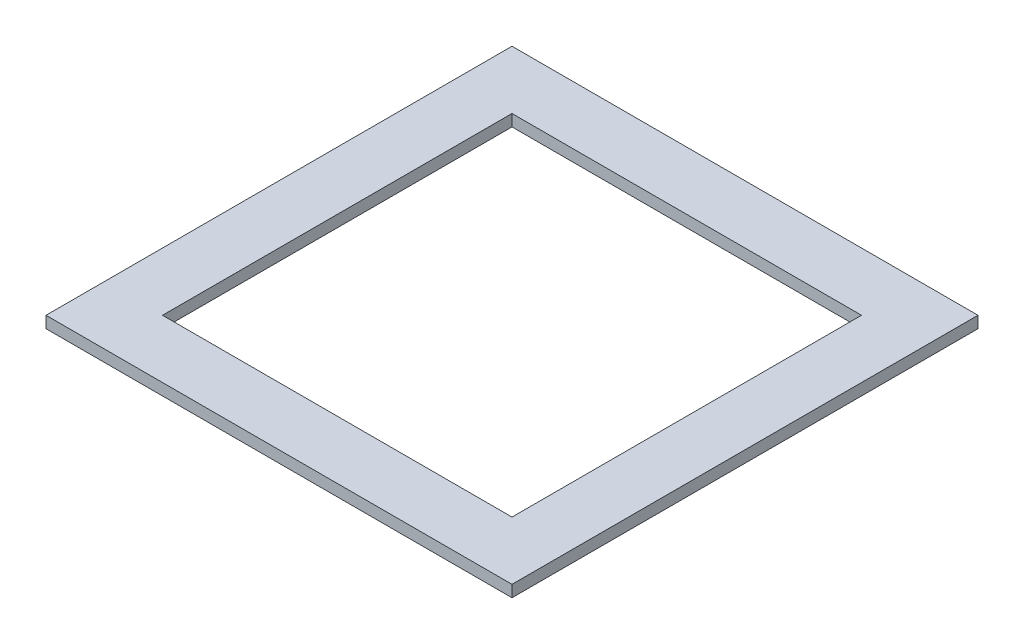
ISO-10303-21;
HEADER;
FILE_DESCRIPTION(('STEP AP214'),'2;1');
FILE_NAME('part.step','',(''),(''),'','','');
FILE_SCHEMA(('AUTOMOTIVE_DESIGN { 1 0 10303 214 1 1 1 1 }'));
ENDSEC;
DATA;
#1=APPLICATION_CONTEXT('core data for automotive mechanical design processes');
#2=APPLICATION_PROTOCOL_DEFINITION('international standard','automotive_design',2000,#1);
#3=PRODUCT_CONTEXT('',#1,'mechanical');
#4=PRODUCT('Part','Part','',(#3));
#5=PRODUCT_RELATED_PRODUCT_CATEGORY('part','',(#4));
#6=PRODUCT_DEFINITION_FORMATION('','',#4);
#7=PRODUCT_DEFINITION_CONTEXT('part definition',#1,'design');
#8=PRODUCT_DEFINITION('design','',#6,#7);
#9=PRODUCT_DEFINITION_SHAPE('','',#8);
#10=(LENGTH_UNIT() NAMED_UNIT(*) SI_UNIT(.MILLI.,.METRE.));
#11=(NAMED_UNIT(*) PLANE_ANGLE_UNIT() SI_UNIT($,.RADIAN.));
#12=(NAMED_UNIT(*) SI_UNIT($,.STERADIAN.) SOLID_ANGLE_UNIT());
#13=UNCERTAINTY_MEASURE_WITH_UNIT(LENGTH_MEASURE(1.E-05),#10,'distance_accuracy_value','');
#14=(GEOMETRIC_REPRESENTATION_CONTEXT(3) GLOBAL_UNCERTAINTY_ASSIGNED_CONTEXT((#13)) GLOBAL_UNIT_ASSIGNED_CONTEXT((#10,
#11,#12)) REPRESENTATION_CONTEXT('',''));
#15=CARTESIAN_POINT('',(0.,0.,0.));
#16=DIRECTION('',(0.,0.,1.));
#17=DIRECTION('',(1.,0.,0.));
#18=AXIS2_PLACEMENT_3D('',#15,#16,#17);
#19=CARTESIAN_POINT('',(0.,0.5,0.));
#20=DIRECTION('',(0.,-1.,0.));
#21=DIRECTION('',(0.,0.,-1.));
#22=AXIS2_PLACEMENT_3D('',#19,#20,#21);
#23=PLANE('',#22);
#24=DIRECTION('',(0.,0.,1.));
#25=VECTOR('',#24,1.);
#26=CARTESIAN_POINT('',(-2.5,0.5,2.5));
#27=LINE('',#26,#25);
#28=CARTESIAN_POINT('',(-2.5,0.5,-17.5));
#29=VERTEX_POINT('',#28);
#30=CARTESIAN_POINT('',(-2.5,0.5,2.5));
#31=VERTEX_POINT('',#30);
#32=EDGE_CURVE('E134',#29,#31,#27,.T.);
#33=ORIENTED_EDGE('',*,*,#32,.T.);
#34=DIRECTION('',(1.,0.,0.));
#35=VECTOR('',#34,1.);
#36=CARTESIAN_POINT('',(-2.5,0.5,2.5));
#37=LINE('',#36,#35);
#38=CARTESIAN_POINT('',(17.5,0.5,2.5));
#39=VERTEX_POINT('',#38);
#40=EDGE_CURVE('E137',#31,#39,#37,.T.);
#41=ORIENTED_EDGE('',*,*,#40,.T.);
#42=DIRECTION('',(0.,0.,-1.));
#43=VECTOR('',#42,1.);
#44=CARTESIAN_POINT('',(17.5,0.5,2.5));
#45=LINE('',#44,#43);
#46=CARTESIAN_POINT('',(17.5,0.5,-17.5));
#47=VERTEX_POINT('',#46);
#48=EDGE_CURVE('E140',#39,#47,#45,.T.);
#49=ORIENTED_EDGE('',*,*,#48,.T.);
#50=DIRECTION('',(-1.,0.,0.));
#51=VECTOR('',#50,1.);
#52=CARTESIAN_POINT('',(-2.5,0.5,-17.5));
#53=LINE('',#52,#51);
#54=EDGE_CURVE('E142',#47,#29,#53,.T.);
#55=ORIENTED_EDGE('',*,*,#54,.T.);
#56=EDGE_LOOP('',(#33,#41,#49,#55));
#57=FACE_BOUND('',#56,.T.);
#58=DIRECTION('',(0.,0.,1.));
#59=VECTOR('',#58,1.);
#60=CARTESIAN_POINT('',(0.,0.5,0.));
#61=LINE('',#60,#59);
#62=CARTESIAN_POINT('',(0.,0.5,-15.));
#63=VERTEX_POINT('',#62);
#64=CARTESIAN_POINT('',(0.,0.5,0.));
#65=VERTEX_POINT('',#64);
#66=EDGE_CURVE('E98',#63,#65,#61,.T.);
#67=ORIENTED_EDGE('',*,*,#66,.F.);
#68=DIRECTION('',(-1.,0.,0.));
#69=VECTOR('',#68,1.);
#70=CARTESIAN_POINT('',(0.,0.5,-15.));
#71=LINE('',#70,#69);
#72=CARTESIAN_POINT('',(15.,0.5,-15.));
#73=VERTEX_POINT('',#72);
#74=EDGE_CURVE('E120',#73,#63,#71,.T.);
#75=ORIENTED_EDGE('',*,*,#74,.F.);
#76=DIRECTION('',(0.,0.,-1.));
#77=VECTOR('',#76,1.);
#78=CARTESIAN_POINT('',(15.,0.5,0.));
#79=LINE('',#78,#77);
#80=CARTESIAN_POINT('',(15.,0.5,0.));
#81=VERTEX_POINT('',#80);
#82=EDGE_CURVE('E118',#81,#73,#79,.T.);
#83=ORIENTED_EDGE('',*,*,#82,.F.);
#84=DIRECTION('',(1.,0.,0.));
#85=VECTOR('',#84,1.);
#86=CARTESIAN_POINT('',(0.,0.5,0.));
#87=LINE('',#86,#85);
#88=EDGE_CURVE('E106',#65,#81,#87,.T.);
#89=ORIENTED_EDGE('',*,*,#88,.F.);
#90=EDGE_LOOP('',(#67,#75,#83,#89));
#91=FACE_BOUND('',#90,.T.);
#92=ADVANCED_FACE('F33',(#57,#91),#23,.F.);
#93=CARTESIAN_POINT('',(0.,0.,0.));
#94=DIRECTION('',(0.,-1.,0.));
#95=DIRECTION('',(0.,0.,-1.));
#96=AXIS2_PLACEMENT_3D('',#93,#94,#95);
#97=PLANE('',#96);
#98=DIRECTION('',(0.,0.,1.));
#99=VECTOR('',#98,1.);
#100=CARTESIAN_POINT('',(-2.5,0.,2.5));
#101=LINE('',#100,#99);
#102=CARTESIAN_POINT('',(-2.5,0.,-17.5));
#103=VERTEX_POINT('',#102);
#104=CARTESIAN_POINT('',(-2.5,0.,2.5));
#105=VERTEX_POINT('',#104);
#106=EDGE_CURVE('E114',#103,#105,#101,.T.);
#107=ORIENTED_EDGE('',*,*,#106,.F.);
#108=DIRECTION('',(-1.,0.,0.));
#109=VECTOR('',#108,1.);
#110=CARTESIAN_POINT('',(-2.5,0.,-17.5));
#111=LINE('',#110,#109);
#112=CARTESIAN_POINT('',(17.5,0.,-17.5));
#113=VERTEX_POINT('',#112);
#114=EDGE_CURVE('E138',#113,#103,#111,.T.);
#115=ORIENTED_EDGE('',*,*,#114,.F.);
#116=DIRECTION('',(0.,0.,-1.));
#117=VECTOR('',#116,1.);
#118=CARTESIAN_POINT('',(17.5,0.,2.5));
#119=LINE('',#118,#117);
#120=CARTESIAN_POINT('',(17.5,0.,2.5));
#121=VERTEX_POINT('',#120);
#122=EDGE_CURVE('E149',#121,#113,#119,.T.);
#123=ORIENTED_EDGE('',*,*,#122,.F.);
#124=DIRECTION('',(1.,0.,0.));
#125=VECTOR('',#124,1.);
#126=CARTESIAN_POINT('',(-2.5,0.,2.5));
#127=LINE('',#126,#125);
#128=EDGE_CURVE('E147',#105,#121,#127,.T.);
#129=ORIENTED_EDGE('',*,*,#128,.F.);
#130=EDGE_LOOP('',(#107,#115,#123,#129));
#131=FACE_BOUND('',#130,.T.);
#132=DIRECTION('',(-1.,0.,0.));
#133=VECTOR('',#132,1.);
#134=CARTESIAN_POINT('',(0.,0.,-15.));
#135=LINE('',#134,#133);
#136=CARTESIAN_POINT('',(15.,0.,-15.));
#137=VERTEX_POINT('',#136);
#138=CARTESIAN_POINT('',(0.,0.,-15.));
#139=VERTEX_POINT('',#138);
#140=EDGE_CURVE('E107',#137,#139,#135,.T.);
#141=ORIENTED_EDGE('',*,*,#140,.T.);
#142=DIRECTION('',(0.,0.,1.));
#143=VECTOR('',#142,1.);
#144=CARTESIAN_POINT('',(0.,0.,0.));
#145=LINE('',#144,#143);
#146=CARTESIAN_POINT('',(0.,0.,0.));
#147=VERTEX_POINT('',#146);
#148=EDGE_CURVE('E56',#139,#147,#145,.T.);
#149=ORIENTED_EDGE('',*,*,#148,.T.);
#150=DIRECTION('',(1.,0.,0.));
#151=VECTOR('',#150,1.);
#152=CARTESIAN_POINT('',(0.,0.,0.));
#153=LINE('',#152,#151);
#154=CARTESIAN_POINT('',(15.,0.,0.));
#155=VERTEX_POINT('',#154);
#156=EDGE_CURVE('E113',#147,#155,#153,.T.);
#157=ORIENTED_EDGE('',*,*,#156,.T.);
#158=DIRECTION('',(0.,0.,-1.));
#159=VECTOR('',#158,1.);
#160=CARTESIAN_POINT('',(15.,0.,0.));
#161=LINE('',#160,#159);
#162=EDGE_CURVE('E126',#155,#137,#161,.T.);
#163=ORIENTED_EDGE('',*,*,#162,.T.);
#164=EDGE_LOOP('',(#141,#149,#157,#163));
#165=FACE_BOUND('',#164,.T.);
#166=ADVANCED_FACE('F167',(#131,#165),#97,.T.);
#167=CARTESIAN_POINT('',(-2.5,0.5,2.5));
#168=DIRECTION('',(1.,0.,0.));
#169=DIRECTION('',(0.,0.,-1.));
#170=AXIS2_PLACEMENT_3D('',#167,#168,#169);
#171=PLANE('',#170);
#172=ORIENTED_EDGE('',*,*,#106,.T.);
#173=DIRECTION('',(0.,-1.,0.));
#174=VECTOR('',#173,1.);
#175=CARTESIAN_POINT('',(-2.5,0.5,2.5));
#176=LINE('',#175,#174);
#177=EDGE_CURVE('E11',#31,#105,#176,.T.);
#178=ORIENTED_EDGE('',*,*,#177,.F.);
#179=ORIENTED_EDGE('',*,*,#32,.F.);
#180=DIRECTION('',(0.,-1.,0.));
#181=VECTOR('',#180,1.);
#182=CARTESIAN_POINT('',(-2.5,0.5,-17.5));
#183=LINE('',#182,#181);
#184=EDGE_CURVE('E144',#29,#103,#183,.T.);
#185=ORIENTED_EDGE('',*,*,#184,.T.);
#186=EDGE_LOOP('',(#172,#178,#179,#185));
#187=FACE_BOUND('',#186,.T.);
#188=ADVANCED_FACE('F35',(#187),#171,.F.);
#189=CARTESIAN_POINT('',(-2.5,0.5,2.5));
#190=DIRECTION('',(0.,0.,-1.));
#191=DIRECTION('',(-1.,0.,0.));
#192=AXIS2_PLACEMENT_3D('',#189,#190,#191);
#193=PLANE('',#192);
#194=ORIENTED_EDGE('',*,*,#128,.T.);
#195=DIRECTION('',(0.,-1.,0.));
#196=VECTOR('',#195,1.);
#197=CARTESIAN_POINT('',(17.5,0.5,2.5));
#198=LINE('',#197,#196);
#199=EDGE_CURVE('E41',#39,#121,#198,.T.);
#200=ORIENTED_EDGE('',*,*,#199,.F.);
#201=ORIENTED_EDGE('',*,*,#40,.F.);
#202=ORIENTED_EDGE('',*,*,#177,.T.);
#203=EDGE_LOOP('',(#194,#200,#201,#202));
#204=FACE_BOUND('',#203,.T.);
#205=ADVANCED_FACE('F177',(#204),#193,.F.);
#206=CARTESIAN_POINT('',(17.5,0.5,2.5));
#207=DIRECTION('',(-1.,0.,0.));
#208=DIRECTION('',(0.,0.,1.));
#209=AXIS2_PLACEMENT_3D('',#206,#207,#208);
#210=PLANE('',#209);
#211=ORIENTED_EDGE('',*,*,#122,.T.);
#212=DIRECTION('',(0.,-1.,0.));
#213=VECTOR('',#212,1.);
#214=CARTESIAN_POINT('',(17.5,0.5,-17.5));
#215=LINE('',#214,#213);
#216=EDGE_CURVE('E154',#47,#113,#215,.T.);
#217=ORIENTED_EDGE('',*,*,#216,.F.);
#218=ORIENTED_EDGE('',*,*,#48,.F.);
#219=ORIENTED_EDGE('',*,*,#199,.T.);
#220=EDGE_LOOP('',(#211,#217,#218,#219));
#221=FACE_BOUND('',#220,.T.);
#222=ADVANCED_FACE('F161',(#221),#210,.F.);
#223=CARTESIAN_POINT('',(-2.5,0.5,-17.5));
#224=DIRECTION('',(0.,0.,1.));
#225=DIRECTION('',(1.,0.,0.));
#226=AXIS2_PLACEMENT_3D('',#223,#224,#225);
#227=PLANE('',#226);
#228=ORIENTED_EDGE('',*,*,#114,.T.);
#229=ORIENTED_EDGE('',*,*,#184,.F.);
#230=ORIENTED_EDGE('',*,*,#54,.F.);
#231=ORIENTED_EDGE('',*,*,#216,.T.);
#232=EDGE_LOOP('',(#228,#229,#230,#231));
#233=FACE_BOUND('',#232,.T.);
#234=ADVANCED_FACE('F171',(#233),#227,.F.);
#235=CARTESIAN_POINT('',(0.,0.5,0.));
#236=DIRECTION('',(1.,0.,0.));
#237=DIRECTION('',(0.,0.,-1.));
#238=AXIS2_PLACEMENT_3D('',#235,#236,#237);
#239=PLANE('',#238);
#240=ORIENTED_EDGE('',*,*,#148,.F.);
#241=DIRECTION('',(0.,-1.,0.));
#242=VECTOR('',#241,1.);
#243=CARTESIAN_POINT('',(0.,0.5,-15.));
#244=LINE('',#243,#242);
#245=EDGE_CURVE('E102',#63,#139,#244,.T.);
#246=ORIENTED_EDGE('',*,*,#245,.F.);
#247=ORIENTED_EDGE('',*,*,#66,.T.);
#248=DIRECTION('',(0.,-1.,0.));
#249=VECTOR('',#248,1.);
#250=CARTESIAN_POINT('',(0.,0.5,0.));
#251=LINE('',#250,#249);
#252=EDGE_CURVE('E101',#65,#147,#251,.T.);
#253=ORIENTED_EDGE('',*,*,#252,.T.);
#254=EDGE_LOOP('',(#240,#246,#247,#253));
#255=FACE_BOUND('',#254,.T.);
#256=ADVANCED_FACE('F100',(#255),#239,.T.);
#257=CARTESIAN_POINT('',(0.,0.5,0.));
#258=DIRECTION('',(0.,0.,-1.));
#259=DIRECTION('',(-1.,0.,0.));
#260=AXIS2_PLACEMENT_3D('',#257,#258,#259);
#261=PLANE('',#260);
#262=ORIENTED_EDGE('',*,*,#156,.F.);
#263=ORIENTED_EDGE('',*,*,#252,.F.);
#264=ORIENTED_EDGE('',*,*,#88,.T.);
#265=DIRECTION('',(0.,-1.,0.));
#266=VECTOR('',#265,1.);
#267=CARTESIAN_POINT('',(15.,0.5,0.));
#268=LINE('',#267,#266);
#269=EDGE_CURVE('E115',#81,#155,#268,.T.);
#270=ORIENTED_EDGE('',*,*,#269,.T.);
#271=EDGE_LOOP('',(#262,#263,#264,#270));
#272=FACE_BOUND('',#271,.T.);
#273=ADVANCED_FACE('F110',(#272),#261,.T.);
#274=CARTESIAN_POINT('',(15.,0.5,0.));
#275=DIRECTION('',(-1.,0.,0.));
#276=DIRECTION('',(0.,0.,1.));
#277=AXIS2_PLACEMENT_3D('',#274,#275,#276);
#278=PLANE('',#277);
#279=ORIENTED_EDGE('',*,*,#162,.F.);
#280=ORIENTED_EDGE('',*,*,#269,.F.);
#281=ORIENTED_EDGE('',*,*,#82,.T.);
#282=DIRECTION('',(0.,-1.,0.));
#283=VECTOR('',#282,1.);
#284=CARTESIAN_POINT('',(15.,0.5,-15.));
#285=LINE('',#284,#283);
#286=EDGE_CURVE('E48',#73,#137,#285,.T.);
#287=ORIENTED_EDGE('',*,*,#286,.T.);
#288=EDGE_LOOP('',(#279,#280,#281,#287));
#289=FACE_BOUND('',#288,.T.);
#290=ADVANCED_FACE('F200',(#289),#278,.T.);
#291=CARTESIAN_POINT('',(0.,0.5,-15.));
#292=DIRECTION('',(0.,0.,1.));
#293=DIRECTION('',(1.,0.,0.));
#294=AXIS2_PLACEMENT_3D('',#291,#292,#293);
#295=PLANE('',#294);
#296=ORIENTED_EDGE('',*,*,#140,.F.);
#297=ORIENTED_EDGE('',*,*,#286,.F.);
#298=ORIENTED_EDGE('',*,*,#74,.T.);
#299=ORIENTED_EDGE('',*,*,#245,.T.);
#300=EDGE_LOOP('',(#296,#297,#298,#299));
#301=FACE_BOUND('',#300,.T.);
#302=ADVANCED_FACE('F204',(#301),#295,.T.);
#303=CLOSED_SHELL('',(#92,#166,#188,#205,#222,#234,#256,#273,#290,#302));
#304=MANIFOLD_SOLID_BREP('B2',#303);
#305=ADVANCED_BREP_SHAPE_REPRESENTATION('',(#18,#304),#14);
#306=SHAPE_DEFINITION_REPRESENTATION(#9,#305);
ENDSEC;
END-ISO-10303-21;
